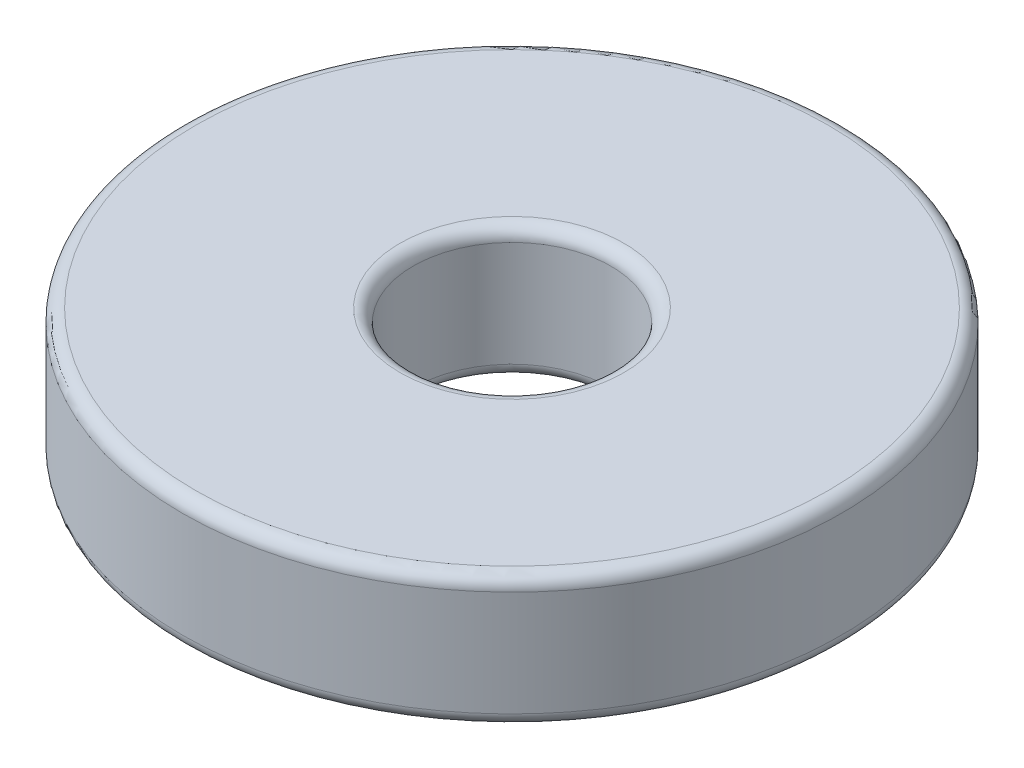
ISO-10303-21;
HEADER;
FILE_DESCRIPTION(('STEP AP214'),'2;1');
FILE_NAME('part.step','',(''),(''),'','','');
FILE_SCHEMA(('AUTOMOTIVE_DESIGN { 1 0 10303 214 1 1 1 1 }'));
ENDSEC;
DATA;
#1=APPLICATION_CONTEXT('core data for automotive mechanical design processes');
#2=APPLICATION_PROTOCOL_DEFINITION('international standard','automotive_design',2000,#1);
#3=PRODUCT_CONTEXT('',#1,'mechanical');
#4=PRODUCT('Part','Part','',(#3));
#5=PRODUCT_RELATED_PRODUCT_CATEGORY('part','',(#4));
#6=PRODUCT_DEFINITION_FORMATION('','',#4);
#7=PRODUCT_DEFINITION_CONTEXT('part definition',#1,'design');
#8=PRODUCT_DEFINITION('design','',#6,#7);
#9=PRODUCT_DEFINITION_SHAPE('','',#8);
#10=(LENGTH_UNIT() NAMED_UNIT(*) SI_UNIT(.MILLI.,.METRE.));
#11=(NAMED_UNIT(*) PLANE_ANGLE_UNIT() SI_UNIT($,.RADIAN.));
#12=(NAMED_UNIT(*) SI_UNIT($,.STERADIAN.) SOLID_ANGLE_UNIT());
#13=UNCERTAINTY_MEASURE_WITH_UNIT(LENGTH_MEASURE(1.E-05),#10,'distance_accuracy_value','');
#14=(GEOMETRIC_REPRESENTATION_CONTEXT(3) GLOBAL_UNCERTAINTY_ASSIGNED_CONTEXT((#13)) GLOBAL_UNIT_ASSIGNED_CONTEXT((#10,
#11,#12)) REPRESENTATION_CONTEXT('',''));
#15=CARTESIAN_POINT('',(0.,0.,0.));
#16=DIRECTION('',(0.,0.,1.));
#17=DIRECTION('',(1.,0.,0.));
#18=AXIS2_PLACEMENT_3D('',#15,#16,#17);
#19=CARTESIAN_POINT('',(0.,5.,0.));
#20=DIRECTION('',(0.,1.,0.));
#21=DIRECTION('',(0.,0.,1.));
#22=AXIS2_PLACEMENT_3D('',#19,#20,#21);
#23=PLANE('',#22);
#24=CARTESIAN_POINT('',(0.,5.,0.));
#25=DIRECTION('',(0.,1.,0.));
#26=DIRECTION('',(0.,0.,1.));
#27=AXIS2_PLACEMENT_3D('',#24,#25,#26);
#28=CIRCLE('',#27,8.5);
#29=CARTESIAN_POINT('',(0.,5.,8.5));
#30=VERTEX_POINT('',#29);
#31=EDGE_CURVE('E10',#30,#30,#28,.F.);
#32=ORIENTED_EDGE('',*,*,#31,.T.);
#33=EDGE_LOOP('',(#32));
#34=FACE_BOUND('',#33,.T.);
#35=CARTESIAN_POINT('',(0.,5.,0.));
#36=DIRECTION('',(0.,1.,0.));
#37=DIRECTION('',(0.,0.,1.));
#38=AXIS2_PLACEMENT_3D('',#35,#36,#37);
#39=CIRCLE('',#38,24.);
#40=CARTESIAN_POINT('',(0.,5.,24.));
#41=VERTEX_POINT('',#40);
#42=EDGE_CURVE('E38',#41,#41,#39,.T.);
#43=ORIENTED_EDGE('',*,*,#42,.T.);
#44=EDGE_LOOP('',(#43));
#45=FACE_BOUND('',#44,.T.);
#46=ADVANCED_FACE('F31',(#34,#45),#23,.T.);
#47=CARTESIAN_POINT('',(0.,-5.,0.));
#48=DIRECTION('',(0.,1.,0.));
#49=DIRECTION('',(0.,0.,1.));
#50=AXIS2_PLACEMENT_3D('',#47,#48,#49);
#51=PLANE('',#50);
#52=CARTESIAN_POINT('',(0.,-5.,0.));
#53=DIRECTION('',(0.,1.,0.));
#54=DIRECTION('',(0.,0.,1.));
#55=AXIS2_PLACEMENT_3D('',#52,#53,#54);
#56=CIRCLE('',#55,8.5);
#57=CARTESIAN_POINT('',(0.,-5.,8.5));
#58=VERTEX_POINT('',#57);
#59=EDGE_CURVE('E57',#58,#58,#56,.T.);
#60=ORIENTED_EDGE('',*,*,#59,.T.);
#61=EDGE_LOOP('',(#60));
#62=FACE_BOUND('',#61,.T.);
#63=CARTESIAN_POINT('',(0.,-5.,0.));
#64=DIRECTION('',(0.,1.,0.));
#65=DIRECTION('',(0.,0.,1.));
#66=AXIS2_PLACEMENT_3D('',#63,#64,#65);
#67=CIRCLE('',#66,24.);
#68=CARTESIAN_POINT('',(0.,-5.,24.));
#69=VERTEX_POINT('',#68);
#70=EDGE_CURVE('E60',#69,#69,#67,.F.);
#71=ORIENTED_EDGE('',*,*,#70,.T.);
#72=EDGE_LOOP('',(#71));
#73=FACE_BOUND('',#72,.T.);
#74=ADVANCED_FACE('F64',(#62,#73),#51,.F.);
#75=CARTESIAN_POINT('',(0.,5.,0.));
#76=DIRECTION('',(0.,-1.,0.));
#77=DIRECTION('',(0.,0.,-1.));
#78=AXIS2_PLACEMENT_3D('',#75,#76,#77);
#79=CYLINDRICAL_SURFACE('',#78,25.);
#80=CARTESIAN_POINT('',(0.,-4.,0.));
#81=DIRECTION('',(0.,1.,0.));
#82=DIRECTION('',(0.,0.,1.));
#83=AXIS2_PLACEMENT_3D('',#80,#81,#82);
#84=CIRCLE('',#83,25.);
#85=CARTESIAN_POINT('',(0.,-4.,25.));
#86=VERTEX_POINT('',#85);
#87=EDGE_CURVE('E42',#86,#86,#84,.T.);
#88=ORIENTED_EDGE('',*,*,#87,.T.);
#89=EDGE_LOOP('',(#88));
#90=FACE_BOUND('',#89,.T.);
#91=CARTESIAN_POINT('',(0.,4.,0.));
#92=DIRECTION('',(0.,1.,0.));
#93=DIRECTION('',(0.,0.,1.));
#94=AXIS2_PLACEMENT_3D('',#91,#92,#93);
#95=CIRCLE('',#94,25.);
#96=CARTESIAN_POINT('',(0.,4.,25.));
#97=VERTEX_POINT('',#96);
#98=EDGE_CURVE('E46',#97,#97,#95,.F.);
#99=ORIENTED_EDGE('',*,*,#98,.T.);
#100=EDGE_LOOP('',(#99));
#101=FACE_BOUND('',#100,.T.);
#102=ADVANCED_FACE('F74',(#90,#101),#79,.T.);
#103=CARTESIAN_POINT('',(0.,5.,0.));
#104=DIRECTION('',(0.,-1.,0.));
#105=DIRECTION('',(0.,0.,-1.));
#106=AXIS2_PLACEMENT_3D('',#103,#104,#105);
#107=CYLINDRICAL_SURFACE('',#106,7.5);
#108=CARTESIAN_POINT('',(0.,-4.,0.));
#109=DIRECTION('',(0.,1.,0.));
#110=DIRECTION('',(0.,0.,1.));
#111=AXIS2_PLACEMENT_3D('',#108,#109,#110);
#112=CIRCLE('',#111,7.5);
#113=CARTESIAN_POINT('',(0.,-4.,7.5));
#114=VERTEX_POINT('',#113);
#115=EDGE_CURVE('E51',#114,#114,#112,.F.);
#116=ORIENTED_EDGE('',*,*,#115,.T.);
#117=EDGE_LOOP('',(#116));
#118=FACE_BOUND('',#117,.T.);
#119=CARTESIAN_POINT('',(0.,4.,0.));
#120=DIRECTION('',(0.,1.,0.));
#121=DIRECTION('',(0.,0.,1.));
#122=AXIS2_PLACEMENT_3D('',#119,#120,#121);
#123=CIRCLE('',#122,7.5);
#124=CARTESIAN_POINT('',(0.,4.,7.5));
#125=VERTEX_POINT('',#124);
#126=EDGE_CURVE('E54',#125,#125,#123,.T.);
#127=ORIENTED_EDGE('',*,*,#126,.T.);
#128=EDGE_LOOP('',(#127));
#129=FACE_BOUND('',#128,.T.);
#130=ADVANCED_FACE('F77',(#118,#129),#107,.F.);
#131=CARTESIAN_POINT('',(0.,-4.,0.));
#132=DIRECTION('',(0.,1.,0.));
#133=DIRECTION('',(0.,0.,1.));
#134=AXIS2_PLACEMENT_3D('',#131,#132,#133);
#135=TOROIDAL_SURFACE('',#134,8.5,1.);
#136=ORIENTED_EDGE('',*,*,#115,.F.);
#137=EDGE_LOOP('',(#136));
#138=FACE_BOUND('',#137,.T.);
#139=ORIENTED_EDGE('',*,*,#59,.F.);
#140=EDGE_LOOP('',(#139));
#141=FACE_BOUND('',#140,.T.);
#142=ADVANCED_FACE('F70',(#138,#141),#135,.T.);
#143=CARTESIAN_POINT('',(0.,-4.,0.));
#144=DIRECTION('',(0.,1.,0.));
#145=DIRECTION('',(0.,0.,1.));
#146=AXIS2_PLACEMENT_3D('',#143,#144,#145);
#147=TOROIDAL_SURFACE('',#146,24.,1.);
#148=ORIENTED_EDGE('',*,*,#70,.F.);
#149=EDGE_LOOP('',(#148));
#150=FACE_BOUND('',#149,.T.);
#151=ORIENTED_EDGE('',*,*,#87,.F.);
#152=EDGE_LOOP('',(#151));
#153=FACE_BOUND('',#152,.T.);
#154=ADVANCED_FACE('F66',(#150,#153),#147,.T.);
#155=CARTESIAN_POINT('',(0.,4.,0.));
#156=DIRECTION('',(0.,1.,0.));
#157=DIRECTION('',(0.,0.,1.));
#158=AXIS2_PLACEMENT_3D('',#155,#156,#157);
#159=TOROIDAL_SURFACE('',#158,8.5,1.);
#160=ORIENTED_EDGE('',*,*,#31,.F.);
#161=EDGE_LOOP('',(#160));
#162=FACE_BOUND('',#161,.T.);
#163=ORIENTED_EDGE('',*,*,#126,.F.);
#164=EDGE_LOOP('',(#163));
#165=FACE_BOUND('',#164,.T.);
#166=ADVANCED_FACE('F69',(#162,#165),#159,.T.);
#167=CARTESIAN_POINT('',(0.,4.,0.));
#168=DIRECTION('',(0.,1.,0.));
#169=DIRECTION('',(0.,0.,1.));
#170=AXIS2_PLACEMENT_3D('',#167,#168,#169);
#171=TOROIDAL_SURFACE('',#170,24.,1.);
#172=ORIENTED_EDGE('',*,*,#98,.F.);
#173=EDGE_LOOP('',(#172));
#174=FACE_BOUND('',#173,.T.);
#175=ORIENTED_EDGE('',*,*,#42,.F.);
#176=EDGE_LOOP('',(#175));
#177=FACE_BOUND('',#176,.T.);
#178=ADVANCED_FACE('F33',(#174,#177),#171,.T.);
#179=CLOSED_SHELL('',(#46,#74,#102,#130,#142,#154,#166,#178));
#180=MANIFOLD_SOLID_BREP('B2',#179);
#181=ADVANCED_BREP_SHAPE_REPRESENTATION('',(#18,#180),#14);
#182=SHAPE_DEFINITION_REPRESENTATION(#9,#181);
ENDSEC;
END-ISO-10303-21;
